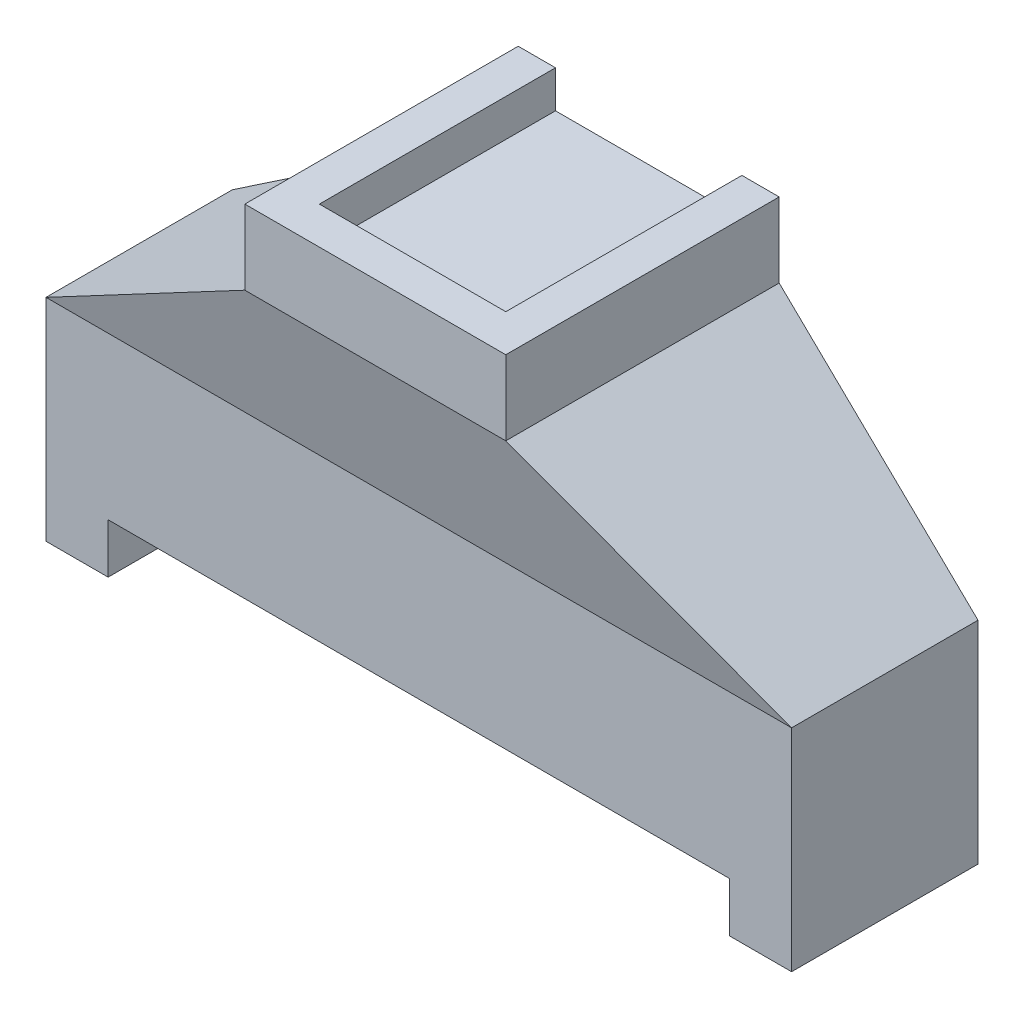
ISO-10303-21;
HEADER;
FILE_DESCRIPTION(('STEP AP214'),'2;1');
FILE_NAME('part.step','',(''),(''),'','','');
FILE_SCHEMA(('AUTOMOTIVE_DESIGN { 1 0 10303 214 1 1 1 1 }'));
ENDSEC;
DATA;
#1=APPLICATION_CONTEXT('core data for automotive mechanical design processes');
#2=APPLICATION_PROTOCOL_DEFINITION('international standard','automotive_design',2000,#1);
#3=PRODUCT_CONTEXT('',#1,'mechanical');
#4=PRODUCT('Part','Part','',(#3));
#5=PRODUCT_RELATED_PRODUCT_CATEGORY('part','',(#4));
#6=PRODUCT_DEFINITION_FORMATION('','',#4);
#7=PRODUCT_DEFINITION_CONTEXT('part definition',#1,'design');
#8=PRODUCT_DEFINITION('design','',#6,#7);
#9=PRODUCT_DEFINITION_SHAPE('','',#8);
#10=(LENGTH_UNIT() NAMED_UNIT(*) SI_UNIT(.MILLI.,.METRE.));
#11=(NAMED_UNIT(*) PLANE_ANGLE_UNIT() SI_UNIT($,.RADIAN.));
#12=(NAMED_UNIT(*) SI_UNIT($,.STERADIAN.) SOLID_ANGLE_UNIT());
#13=UNCERTAINTY_MEASURE_WITH_UNIT(LENGTH_MEASURE(1.E-05),#10,'distance_accuracy_value','');
#14=(GEOMETRIC_REPRESENTATION_CONTEXT(3) GLOBAL_UNCERTAINTY_ASSIGNED_CONTEXT((#13)) GLOBAL_UNIT_ASSIGNED_CONTEXT((#10,
#11,#12)) REPRESENTATION_CONTEXT('',''));
#15=CARTESIAN_POINT('',(0.,0.,0.));
#16=DIRECTION('',(0.,0.,1.));
#17=DIRECTION('',(1.,0.,0.));
#18=AXIS2_PLACEMENT_3D('',#15,#16,#17);
#19=CARTESIAN_POINT('',(30.,13.,7.5));
#20=DIRECTION('',(-1.,0.,0.));
#21=DIRECTION('',(0.,0.,1.));
#22=AXIS2_PLACEMENT_3D('',#19,#20,#21);
#23=PLANE('',#22);
#24=DIRECTION('',(0.,-1.,0.));
#25=VECTOR('',#24,1.);
#26=CARTESIAN_POINT('',(30.,13.,7.5));
#27=LINE('',#26,#25);
#28=CARTESIAN_POINT('',(30.,13.,7.5));
#29=VERTEX_POINT('',#28);
#30=CARTESIAN_POINT('',(30.,-4.,7.5));
#31=VERTEX_POINT('',#30);
#32=EDGE_CURVE('E292',#29,#31,#27,.T.);
#33=ORIENTED_EDGE('',*,*,#32,.T.);
#34=DIRECTION('',(0.,0.,-1.));
#35=VECTOR('',#34,1.);
#36=CARTESIAN_POINT('',(30.,-4.,7.5));
#37=LINE('',#36,#35);
#38=CARTESIAN_POINT('',(30.,-4.,-7.5));
#39=VERTEX_POINT('',#38);
#40=EDGE_CURVE('E252',#31,#39,#37,.T.);
#41=ORIENTED_EDGE('',*,*,#40,.T.);
#42=DIRECTION('',(0.,-1.,0.));
#43=VECTOR('',#42,1.);
#44=CARTESIAN_POINT('',(30.,13.,-7.5));
#45=LINE('',#44,#43);
#46=CARTESIAN_POINT('',(30.,13.,-7.5));
#47=VERTEX_POINT('',#46);
#48=EDGE_CURVE('E12',#47,#39,#45,.T.);
#49=ORIENTED_EDGE('',*,*,#48,.F.);
#50=DIRECTION('',(0.,0.,1.));
#51=VECTOR('',#50,1.);
#52=CARTESIAN_POINT('',(30.,13.,0.));
#53=LINE('',#52,#51);
#54=EDGE_CURVE('E123',#29,#47,#53,.F.);
#55=ORIENTED_EDGE('',*,*,#54,.F.);
#56=EDGE_LOOP('',(#33,#41,#49,#55));
#57=FACE_BOUND('',#56,.T.);
#58=ADVANCED_FACE('F41',(#57),#23,.F.);
#59=CARTESIAN_POINT('',(-30.,13.,-7.5));
#60=DIRECTION('',(0.,0.,1.));
#61=DIRECTION('',(1.,0.,0.));
#62=AXIS2_PLACEMENT_3D('',#59,#60,#61);
#63=PLANE('',#62);
#64=ORIENTED_EDGE('',*,*,#48,.T.);
#65=DIRECTION('',(-1.,0.,0.));
#66=VECTOR('',#65,1.);
#67=CARTESIAN_POINT('',(30.,-4.,-7.5));
#68=LINE('',#67,#66);
#69=CARTESIAN_POINT('',(25.,-4.,-7.5));
#70=VERTEX_POINT('',#69);
#71=EDGE_CURVE('E261',#39,#70,#68,.T.);
#72=ORIENTED_EDGE('',*,*,#71,.T.);
#73=DIRECTION('',(0.,1.,0.));
#74=VECTOR('',#73,1.);
#75=CARTESIAN_POINT('',(25.,-4.,-7.5));
#76=LINE('',#75,#74);
#77=CARTESIAN_POINT('',(25.,0.,-7.5));
#78=VERTEX_POINT('',#77);
#79=EDGE_CURVE('E264',#70,#78,#76,.T.);
#80=ORIENTED_EDGE('',*,*,#79,.T.);
#81=DIRECTION('',(-1.,0.,0.));
#82=VECTOR('',#81,1.);
#83=CARTESIAN_POINT('',(-30.,0.,-7.5));
#84=LINE('',#83,#82);
#85=CARTESIAN_POINT('',(-25.,0.,-7.5));
#86=VERTEX_POINT('',#85);
#87=EDGE_CURVE('E287',#78,#86,#84,.T.);
#88=ORIENTED_EDGE('',*,*,#87,.T.);
#89=DIRECTION('',(0.,1.,0.));
#90=VECTOR('',#89,1.);
#91=CARTESIAN_POINT('',(-25.,-4.,-7.5));
#92=LINE('',#91,#90);
#93=CARTESIAN_POINT('',(-25.,-4.,-7.5));
#94=VERTEX_POINT('',#93);
#95=EDGE_CURVE('E284',#94,#86,#92,.T.);
#96=ORIENTED_EDGE('',*,*,#95,.F.);
#97=DIRECTION('',(1.,0.,0.));
#98=VECTOR('',#97,1.);
#99=CARTESIAN_POINT('',(-30.,-4.,-7.5));
#100=LINE('',#99,#98);
#101=CARTESIAN_POINT('',(-30.,-4.,-7.5));
#102=VERTEX_POINT('',#101);
#103=EDGE_CURVE('E97',#102,#94,#100,.T.);
#104=ORIENTED_EDGE('',*,*,#103,.F.);
#105=DIRECTION('',(0.,-1.,0.));
#106=VECTOR('',#105,1.);
#107=CARTESIAN_POINT('',(-30.,13.,-7.5));
#108=LINE('',#107,#106);
#109=CARTESIAN_POINT('',(-30.,13.,-7.5));
#110=VERTEX_POINT('',#109);
#111=EDGE_CURVE('E50',#110,#102,#108,.T.);
#112=ORIENTED_EDGE('',*,*,#111,.F.);
#113=DIRECTION('',(1.,0.,0.));
#114=VECTOR('',#113,1.);
#115=CARTESIAN_POINT('',(0.,13.,-7.5));
#116=LINE('',#115,#114);
#117=EDGE_CURVE('E92',#47,#110,#116,.F.);
#118=ORIENTED_EDGE('',*,*,#117,.F.);
#119=EDGE_LOOP('',(#64,#72,#80,#88,#96,#104,#112,#118));
#120=FACE_BOUND('',#119,.T.);
#121=ADVANCED_FACE('F90',(#120),#63,.F.);
#122=CARTESIAN_POINT('',(-30.,13.,7.5));
#123=DIRECTION('',(1.,0.,0.));
#124=DIRECTION('',(0.,0.,-1.));
#125=AXIS2_PLACEMENT_3D('',#122,#123,#124);
#126=PLANE('',#125);
#127=ORIENTED_EDGE('',*,*,#111,.T.);
#128=DIRECTION('',(0.,0.,-1.));
#129=VECTOR('',#128,1.);
#130=CARTESIAN_POINT('',(-30.,-4.,7.5));
#131=LINE('',#130,#129);
#132=CARTESIAN_POINT('',(-30.,-4.,7.5));
#133=VERTEX_POINT('',#132);
#134=EDGE_CURVE('E270',#133,#102,#131,.T.);
#135=ORIENTED_EDGE('',*,*,#134,.F.);
#136=DIRECTION('',(0.,-1.,0.));
#137=VECTOR('',#136,1.);
#138=CARTESIAN_POINT('',(-30.,13.,7.5));
#139=LINE('',#138,#137);
#140=CARTESIAN_POINT('',(-30.,13.,7.5));
#141=VERTEX_POINT('',#140);
#142=EDGE_CURVE('E101',#141,#133,#139,.T.);
#143=ORIENTED_EDGE('',*,*,#142,.F.);
#144=DIRECTION('',(0.,0.,1.));
#145=VECTOR('',#144,1.);
#146=CARTESIAN_POINT('',(-30.,13.,0.));
#147=LINE('',#146,#145);
#148=EDGE_CURVE('E104',#110,#141,#147,.T.);
#149=ORIENTED_EDGE('',*,*,#148,.F.);
#150=EDGE_LOOP('',(#127,#135,#143,#149));
#151=FACE_BOUND('',#150,.T.);
#152=ADVANCED_FACE('F105',(#151),#126,.F.);
#153=CARTESIAN_POINT('',(-30.,13.,7.5));
#154=DIRECTION('',(0.,0.,-1.));
#155=DIRECTION('',(-1.,0.,0.));
#156=AXIS2_PLACEMENT_3D('',#153,#154,#155);
#157=PLANE('',#156);
#158=ORIENTED_EDGE('',*,*,#142,.T.);
#159=DIRECTION('',(-1.,0.,0.));
#160=VECTOR('',#159,1.);
#161=CARTESIAN_POINT('',(-30.,-4.,7.5));
#162=LINE('',#161,#160);
#163=CARTESIAN_POINT('',(-25.,-4.,7.5));
#164=VERTEX_POINT('',#163);
#165=EDGE_CURVE('E276',#164,#133,#162,.T.);
#166=ORIENTED_EDGE('',*,*,#165,.F.);
#167=DIRECTION('',(0.,1.,0.));
#168=VECTOR('',#167,1.);
#169=CARTESIAN_POINT('',(-25.,-4.,7.5));
#170=LINE('',#169,#168);
#171=CARTESIAN_POINT('',(-25.,0.,7.5));
#172=VERTEX_POINT('',#171);
#173=EDGE_CURVE('E279',#164,#172,#170,.T.);
#174=ORIENTED_EDGE('',*,*,#173,.T.);
#175=DIRECTION('',(1.,0.,0.));
#176=VECTOR('',#175,1.);
#177=CARTESIAN_POINT('',(-30.,0.,7.5));
#178=LINE('',#177,#176);
#179=CARTESIAN_POINT('',(25.,0.,7.5));
#180=VERTEX_POINT('',#179);
#181=EDGE_CURVE('E289',#172,#180,#178,.T.);
#182=ORIENTED_EDGE('',*,*,#181,.T.);
#183=DIRECTION('',(0.,1.,0.));
#184=VECTOR('',#183,1.);
#185=CARTESIAN_POINT('',(25.,-4.,7.5));
#186=LINE('',#185,#184);
#187=CARTESIAN_POINT('',(25.,-4.,7.5));
#188=VERTEX_POINT('',#187);
#189=EDGE_CURVE('E267',#188,#180,#186,.T.);
#190=ORIENTED_EDGE('',*,*,#189,.F.);
#191=DIRECTION('',(1.,0.,0.));
#192=VECTOR('',#191,1.);
#193=CARTESIAN_POINT('',(30.,-4.,7.5));
#194=LINE('',#193,#192);
#195=EDGE_CURVE('E255',#188,#31,#194,.T.);
#196=ORIENTED_EDGE('',*,*,#195,.T.);
#197=ORIENTED_EDGE('',*,*,#32,.F.);
#198=DIRECTION('',(1.,0.,0.));
#199=VECTOR('',#198,1.);
#200=CARTESIAN_POINT('',(0.,13.,7.5));
#201=LINE('',#200,#199);
#202=EDGE_CURVE('E112',#141,#29,#201,.T.);
#203=ORIENTED_EDGE('',*,*,#202,.F.);
#204=EDGE_LOOP('',(#158,#166,#174,#182,#190,#196,#197,#203));
#205=FACE_BOUND('',#204,.T.);
#206=ADVANCED_FACE('F442',(#205),#157,.F.);
#207=CARTESIAN_POINT('',(0.,0.,0.));
#208=DIRECTION('',(0.,-1.,0.));
#209=DIRECTION('',(0.,0.,-1.));
#210=AXIS2_PLACEMENT_3D('',#207,#208,#209);
#211=PLANE('',#210);
#212=DIRECTION('',(0.,0.,1.));
#213=VECTOR('',#212,1.);
#214=CARTESIAN_POINT('',(25.,0.,7.5));
#215=LINE('',#214,#213);
#216=EDGE_CURVE('E67',#78,#180,#215,.T.);
#217=ORIENTED_EDGE('',*,*,#216,.T.);
#218=ORIENTED_EDGE('',*,*,#181,.F.);
#219=DIRECTION('',(0.,0.,1.));
#220=VECTOR('',#219,1.);
#221=CARTESIAN_POINT('',(-25.,0.,7.5));
#222=LINE('',#221,#220);
#223=EDGE_CURVE('E269',#86,#172,#222,.T.);
#224=ORIENTED_EDGE('',*,*,#223,.F.);
#225=ORIENTED_EDGE('',*,*,#87,.F.);
#226=EDGE_LOOP('',(#217,#218,#224,#225));
#227=FACE_BOUND('',#226,.T.);
#228=ADVANCED_FACE('F434',(#227),#211,.T.);
#229=CARTESIAN_POINT('',(-25.,-4.,7.5));
#230=DIRECTION('',(-1.,0.,0.));
#231=DIRECTION('',(0.,0.,1.));
#232=AXIS2_PLACEMENT_3D('',#229,#230,#231);
#233=PLANE('',#232);
#234=ORIENTED_EDGE('',*,*,#223,.T.);
#235=ORIENTED_EDGE('',*,*,#173,.F.);
#236=DIRECTION('',(0.,0.,1.));
#237=VECTOR('',#236,1.);
#238=CARTESIAN_POINT('',(-25.,-4.,7.5));
#239=LINE('',#238,#237);
#240=EDGE_CURVE('E273',#94,#164,#239,.T.);
#241=ORIENTED_EDGE('',*,*,#240,.F.);
#242=ORIENTED_EDGE('',*,*,#95,.T.);
#243=EDGE_LOOP('',(#234,#235,#241,#242));
#244=FACE_BOUND('',#243,.T.);
#245=ADVANCED_FACE('F439',(#244),#233,.F.);
#246=CARTESIAN_POINT('',(0.,-4.,0.));
#247=DIRECTION('',(0.,-1.,0.));
#248=DIRECTION('',(0.,0.,-1.));
#249=AXIS2_PLACEMENT_3D('',#246,#247,#248);
#250=PLANE('',#249);
#251=ORIENTED_EDGE('',*,*,#134,.T.);
#252=ORIENTED_EDGE('',*,*,#103,.T.);
#253=ORIENTED_EDGE('',*,*,#240,.T.);
#254=ORIENTED_EDGE('',*,*,#165,.T.);
#255=EDGE_LOOP('',(#251,#252,#253,#254));
#256=FACE_BOUND('',#255,.T.);
#257=ADVANCED_FACE('F444',(#256),#250,.T.);
#258=CARTESIAN_POINT('',(25.,-4.,7.5));
#259=DIRECTION('',(-1.,0.,0.));
#260=DIRECTION('',(0.,0.,1.));
#261=AXIS2_PLACEMENT_3D('',#258,#259,#260);
#262=PLANE('',#261);
#263=ORIENTED_EDGE('',*,*,#216,.F.);
#264=ORIENTED_EDGE('',*,*,#79,.F.);
#265=DIRECTION('',(0.,0.,1.));
#266=VECTOR('',#265,1.);
#267=CARTESIAN_POINT('',(25.,-4.,7.5));
#268=LINE('',#267,#266);
#269=EDGE_CURVE('E258',#70,#188,#268,.T.);
#270=ORIENTED_EDGE('',*,*,#269,.T.);
#271=ORIENTED_EDGE('',*,*,#189,.T.);
#272=EDGE_LOOP('',(#263,#264,#270,#271));
#273=FACE_BOUND('',#272,.T.);
#274=ADVANCED_FACE('F447',(#273),#262,.T.);
#275=CARTESIAN_POINT('',(0.,-4.,0.));
#276=DIRECTION('',(0.,-1.,0.));
#277=DIRECTION('',(0.,0.,-1.));
#278=AXIS2_PLACEMENT_3D('',#275,#276,#277);
#279=PLANE('',#278);
#280=ORIENTED_EDGE('',*,*,#40,.F.);
#281=ORIENTED_EDGE('',*,*,#195,.F.);
#282=ORIENTED_EDGE('',*,*,#269,.F.);
#283=ORIENTED_EDGE('',*,*,#71,.F.);
#284=EDGE_LOOP('',(#280,#281,#282,#283));
#285=FACE_BOUND('',#284,.T.);
#286=ADVANCED_FACE('F451',(#285),#279,.T.);
#287=CARTESIAN_POINT('',(-14.0429184549356,22.8197424892704,0.));
#288=DIRECTION('',(-0.524097425664335,0.851658316704544,0.));
#289=DIRECTION('',(-0.851658316704544,-0.524097425664335,0.));
#290=AXIS2_PLACEMENT_3D('',#287,#288,#289);
#291=PLANE('',#290);
#292=DIRECTION('',(0.841879138963874,0.518079470131615,0.151106512121721));
#293=VECTOR('',#292,1.);
#294=CARTESIAN_POINT('',(-30.,13.,7.5));
#295=LINE('',#294,#293);
#296=CARTESIAN_POINT('',(-10.5,25.,11.));
#297=VERTEX_POINT('',#296);
#298=EDGE_CURVE('E130',#141,#297,#295,.T.);
#299=ORIENTED_EDGE('',*,*,#298,.T.);
#300=DIRECTION('',(0.,0.,-1.));
#301=VECTOR('',#300,1.);
#302=CARTESIAN_POINT('',(-10.5,25.,11.));
#303=LINE('',#302,#301);
#304=CARTESIAN_POINT('',(-10.5,25.,-11.));
#305=VERTEX_POINT('',#304);
#306=EDGE_CURVE('E44',#297,#305,#303,.T.);
#307=ORIENTED_EDGE('',*,*,#306,.T.);
#308=DIRECTION('',(0.841879138963874,0.518079470131615,-0.151106512121721));
#309=VECTOR('',#308,1.);
#310=CARTESIAN_POINT('',(-30.,13.,-7.5));
#311=LINE('',#310,#309);
#312=EDGE_CURVE('E120',#110,#305,#311,.T.);
#313=ORIENTED_EDGE('',*,*,#312,.F.);
#314=ORIENTED_EDGE('',*,*,#148,.T.);
#315=EDGE_LOOP('',(#299,#307,#313,#314));
#316=FACE_BOUND('',#315,.T.);
#317=ADVANCED_FACE('F126',(#316),#291,.T.);
#318=CARTESIAN_POINT('',(0.,-0.9968,-3.4176));
#319=DIRECTION('',(0.,0.28,0.96));
#320=DIRECTION('',(0.,-0.96,0.28));
#321=AXIS2_PLACEMENT_3D('',#318,#319,#320);
#322=PLANE('',#321);
#323=ORIENTED_EDGE('',*,*,#312,.T.);
#324=DIRECTION('',(1.,0.,0.));
#325=VECTOR('',#324,1.);
#326=CARTESIAN_POINT('',(-10.5,25.,-11.));
#327=LINE('',#326,#325);
#328=CARTESIAN_POINT('',(10.5,25.,-11.));
#329=VERTEX_POINT('',#328);
#330=EDGE_CURVE('E144',#305,#329,#327,.T.);
#331=ORIENTED_EDGE('',*,*,#330,.T.);
#332=DIRECTION('',(-0.841879138963874,0.518079470131615,-0.151106512121721));
#333=VECTOR('',#332,1.);
#334=CARTESIAN_POINT('',(30.,13.,-7.5));
#335=LINE('',#334,#333);
#336=EDGE_CURVE('E122',#47,#329,#335,.T.);
#337=ORIENTED_EDGE('',*,*,#336,.F.);
#338=ORIENTED_EDGE('',*,*,#117,.T.);
#339=EDGE_LOOP('',(#323,#331,#337,#338));
#340=FACE_BOUND('',#339,.T.);
#341=ADVANCED_FACE('F117',(#340),#322,.F.);
#342=CARTESIAN_POINT('',(0.,-0.996799999999999,3.41759999999999));
#343=DIRECTION('',(0.,0.28,-0.96));
#344=DIRECTION('',(0.,0.96,0.28));
#345=AXIS2_PLACEMENT_3D('',#342,#343,#344);
#346=PLANE('',#345);
#347=DIRECTION('',(-0.841879138963874,0.518079470131615,0.151106512121721));
#348=VECTOR('',#347,1.);
#349=CARTESIAN_POINT('',(30.,13.,7.5));
#350=LINE('',#349,#348);
#351=CARTESIAN_POINT('',(10.5,25.,11.));
#352=VERTEX_POINT('',#351);
#353=EDGE_CURVE('E129',#29,#352,#350,.T.);
#354=ORIENTED_EDGE('',*,*,#353,.T.);
#355=DIRECTION('',(-1.,0.,0.));
#356=VECTOR('',#355,1.);
#357=CARTESIAN_POINT('',(-10.5,25.,11.));
#358=LINE('',#357,#356);
#359=EDGE_CURVE('E245',#352,#297,#358,.T.);
#360=ORIENTED_EDGE('',*,*,#359,.T.);
#361=ORIENTED_EDGE('',*,*,#298,.F.);
#362=ORIENTED_EDGE('',*,*,#202,.T.);
#363=EDGE_LOOP('',(#354,#360,#361,#362));
#364=FACE_BOUND('',#363,.T.);
#365=ADVANCED_FACE('F158',(#364),#346,.F.);
#366=CARTESIAN_POINT('',(14.0429184549356,22.8197424892704,0.));
#367=DIRECTION('',(0.524097425664335,0.851658316704544,0.));
#368=DIRECTION('',(-0.851658316704544,0.524097425664335,0.));
#369=AXIS2_PLACEMENT_3D('',#366,#367,#368);
#370=PLANE('',#369);
#371=ORIENTED_EDGE('',*,*,#336,.T.);
#372=DIRECTION('',(0.,0.,1.));
#373=VECTOR('',#372,1.);
#374=CARTESIAN_POINT('',(10.5,25.,11.));
#375=LINE('',#374,#373);
#376=EDGE_CURVE('E185',#329,#352,#375,.T.);
#377=ORIENTED_EDGE('',*,*,#376,.T.);
#378=ORIENTED_EDGE('',*,*,#353,.F.);
#379=ORIENTED_EDGE('',*,*,#54,.T.);
#380=EDGE_LOOP('',(#371,#377,#378,#379));
#381=FACE_BOUND('',#380,.T.);
#382=ADVANCED_FACE('F164',(#381),#370,.T.);
#383=CARTESIAN_POINT('',(10.5,25.,11.));
#384=DIRECTION('',(-1.,0.,0.));
#385=DIRECTION('',(0.,0.,1.));
#386=AXIS2_PLACEMENT_3D('',#383,#384,#385);
#387=PLANE('',#386);
#388=DIRECTION('',(0.,1.,0.));
#389=VECTOR('',#388,1.);
#390=CARTESIAN_POINT('',(10.5,25.,-11.));
#391=LINE('',#390,#389);
#392=CARTESIAN_POINT('',(10.5,31.,-11.));
#393=VERTEX_POINT('',#392);
#394=EDGE_CURVE('E306',#329,#393,#391,.T.);
#395=ORIENTED_EDGE('',*,*,#394,.T.);
#396=DIRECTION('',(0.,0.,1.));
#397=VECTOR('',#396,1.);
#398=CARTESIAN_POINT('',(10.5,31.,-11.));
#399=LINE('',#398,#397);
#400=CARTESIAN_POINT('',(10.5,31.,11.));
#401=VERTEX_POINT('',#400);
#402=EDGE_CURVE('E363',#393,#401,#399,.T.);
#403=ORIENTED_EDGE('',*,*,#402,.T.);
#404=DIRECTION('',(0.,1.,0.));
#405=VECTOR('',#404,1.);
#406=CARTESIAN_POINT('',(10.5,25.,11.));
#407=LINE('',#406,#405);
#408=EDGE_CURVE('E134',#352,#401,#407,.T.);
#409=ORIENTED_EDGE('',*,*,#408,.F.);
#410=ORIENTED_EDGE('',*,*,#376,.F.);
#411=EDGE_LOOP('',(#395,#403,#409,#410));
#412=FACE_BOUND('',#411,.T.);
#413=ADVANCED_FACE('F225',(#412),#387,.F.);
#414=CARTESIAN_POINT('',(-10.5,25.,11.));
#415=DIRECTION('',(0.,0.,-1.));
#416=DIRECTION('',(-1.,0.,0.));
#417=AXIS2_PLACEMENT_3D('',#414,#415,#416);
#418=PLANE('',#417);
#419=ORIENTED_EDGE('',*,*,#408,.T.);
#420=DIRECTION('',(-1.,0.,0.));
#421=VECTOR('',#420,1.);
#422=CARTESIAN_POINT('',(10.5,31.,11.));
#423=LINE('',#422,#421);
#424=CARTESIAN_POINT('',(-10.5,31.,11.));
#425=VERTEX_POINT('',#424);
#426=EDGE_CURVE('E345',#401,#425,#423,.T.);
#427=ORIENTED_EDGE('',*,*,#426,.T.);
#428=DIRECTION('',(0.,1.,0.));
#429=VECTOR('',#428,1.);
#430=CARTESIAN_POINT('',(-10.5,25.,11.));
#431=LINE('',#430,#429);
#432=EDGE_CURVE('E242',#297,#425,#431,.T.);
#433=ORIENTED_EDGE('',*,*,#432,.F.);
#434=ORIENTED_EDGE('',*,*,#359,.F.);
#435=EDGE_LOOP('',(#419,#427,#433,#434));
#436=FACE_BOUND('',#435,.T.);
#437=ADVANCED_FACE('F220',(#436),#418,.F.);
#438=CARTESIAN_POINT('',(-10.5,25.,11.));
#439=DIRECTION('',(1.,0.,0.));
#440=DIRECTION('',(0.,0.,-1.));
#441=AXIS2_PLACEMENT_3D('',#438,#439,#440);
#442=PLANE('',#441);
#443=ORIENTED_EDGE('',*,*,#432,.T.);
#444=DIRECTION('',(0.,0.,-1.));
#445=VECTOR('',#444,1.);
#446=CARTESIAN_POINT('',(-10.5,31.,11.));
#447=LINE('',#446,#445);
#448=CARTESIAN_POINT('',(-10.5,31.,-11.));
#449=VERTEX_POINT('',#448);
#450=EDGE_CURVE('E354',#425,#449,#447,.T.);
#451=ORIENTED_EDGE('',*,*,#450,.T.);
#452=DIRECTION('',(0.,1.,0.));
#453=VECTOR('',#452,1.);
#454=CARTESIAN_POINT('',(-10.5,25.,-11.));
#455=LINE('',#454,#453);
#456=EDGE_CURVE('E300',#305,#449,#455,.T.);
#457=ORIENTED_EDGE('',*,*,#456,.F.);
#458=ORIENTED_EDGE('',*,*,#306,.F.);
#459=EDGE_LOOP('',(#443,#451,#457,#458));
#460=FACE_BOUND('',#459,.T.);
#461=ADVANCED_FACE('F209',(#460),#442,.F.);
#462=CARTESIAN_POINT('',(-10.5,25.,-11.));
#463=DIRECTION('',(0.,0.,1.));
#464=DIRECTION('',(1.,0.,0.));
#465=AXIS2_PLACEMENT_3D('',#462,#463,#464);
#466=PLANE('',#465);
#467=ORIENTED_EDGE('',*,*,#456,.T.);
#468=DIRECTION('',(1.,0.,0.));
#469=VECTOR('',#468,1.);
#470=CARTESIAN_POINT('',(-10.5,31.,-11.));
#471=LINE('',#470,#469);
#472=CARTESIAN_POINT('',(-7.5,31.,-11.));
#473=VERTEX_POINT('',#472);
#474=EDGE_CURVE('E377',#449,#473,#471,.T.);
#475=ORIENTED_EDGE('',*,*,#474,.T.);
#476=DIRECTION('',(0.,-1.,0.));
#477=VECTOR('',#476,1.);
#478=CARTESIAN_POINT('',(-7.5,31.,-11.));
#479=LINE('',#478,#477);
#480=CARTESIAN_POINT('',(-7.5,28.,-11.));
#481=VERTEX_POINT('',#480);
#482=EDGE_CURVE('E341',#473,#481,#479,.T.);
#483=ORIENTED_EDGE('',*,*,#482,.T.);
#484=DIRECTION('',(1.,0.,0.));
#485=VECTOR('',#484,1.);
#486=CARTESIAN_POINT('',(-10.5,28.,-11.));
#487=LINE('',#486,#485);
#488=CARTESIAN_POINT('',(7.49999999999999,28.,-11.));
#489=VERTEX_POINT('',#488);
#490=EDGE_CURVE('E312',#481,#489,#487,.T.);
#491=ORIENTED_EDGE('',*,*,#490,.T.);
#492=DIRECTION('',(0.,-1.,0.));
#493=VECTOR('',#492,1.);
#494=CARTESIAN_POINT('',(7.5,31.,-11.));
#495=LINE('',#494,#493);
#496=CARTESIAN_POINT('',(7.5,31.,-11.));
#497=VERTEX_POINT('',#496);
#498=EDGE_CURVE('E58',#497,#489,#495,.T.);
#499=ORIENTED_EDGE('',*,*,#498,.F.);
#500=DIRECTION('',(1.,0.,0.));
#501=VECTOR('',#500,1.);
#502=CARTESIAN_POINT('',(7.5,31.,-11.));
#503=LINE('',#502,#501);
#504=EDGE_CURVE('E366',#497,#393,#503,.T.);
#505=ORIENTED_EDGE('',*,*,#504,.T.);
#506=ORIENTED_EDGE('',*,*,#394,.F.);
#507=ORIENTED_EDGE('',*,*,#330,.F.);
#508=EDGE_LOOP('',(#467,#475,#483,#491,#499,#505,#506,#507));
#509=FACE_BOUND('',#508,.T.);
#510=ADVANCED_FACE('F219',(#509),#466,.F.);
#511=CARTESIAN_POINT('',(0.,28.,0.));
#512=DIRECTION('',(0.,-1.,0.));
#513=DIRECTION('',(0.,0.,-1.));
#514=AXIS2_PLACEMENT_3D('',#511,#512,#513);
#515=PLANE('',#514);
#516=ORIENTED_EDGE('',*,*,#490,.F.);
#517=DIRECTION('',(0.,0.,1.));
#518=VECTOR('',#517,1.);
#519=CARTESIAN_POINT('',(-7.5,28.,-11.));
#520=LINE('',#519,#518);
#521=CARTESIAN_POINT('',(-7.5,28.,8.));
#522=VERTEX_POINT('',#521);
#523=EDGE_CURVE('E358',#481,#522,#520,.T.);
#524=ORIENTED_EDGE('',*,*,#523,.T.);
#525=DIRECTION('',(1.,0.,0.));
#526=VECTOR('',#525,1.);
#527=CARTESIAN_POINT('',(-7.5,28.,8.));
#528=LINE('',#527,#526);
#529=CARTESIAN_POINT('',(7.5,28.,8.00000000000001));
#530=VERTEX_POINT('',#529);
#531=EDGE_CURVE('E355',#522,#530,#528,.T.);
#532=ORIENTED_EDGE('',*,*,#531,.T.);
#533=DIRECTION('',(0.,0.,-1.));
#534=VECTOR('',#533,1.);
#535=CARTESIAN_POINT('',(7.5,28.,8.00000000000001));
#536=LINE('',#535,#534);
#537=EDGE_CURVE('E352',#530,#489,#536,.T.);
#538=ORIENTED_EDGE('',*,*,#537,.T.);
#539=EDGE_LOOP('',(#516,#524,#532,#538));
#540=FACE_BOUND('',#539,.T.);
#541=ADVANCED_FACE('F511',(#540),#515,.F.);
#542=CARTESIAN_POINT('',(7.5,31.,8.00000000000001));
#543=DIRECTION('',(-1.,0.,0.));
#544=DIRECTION('',(0.,0.,1.));
#545=AXIS2_PLACEMENT_3D('',#542,#543,#544);
#546=PLANE('',#545);
#547=ORIENTED_EDGE('',*,*,#537,.F.);
#548=DIRECTION('',(0.,-1.,0.));
#549=VECTOR('',#548,1.);
#550=CARTESIAN_POINT('',(7.5,31.,8.00000000000001));
#551=LINE('',#550,#549);
#552=CARTESIAN_POINT('',(7.5,31.,8.00000000000001));
#553=VERTEX_POINT('',#552);
#554=EDGE_CURVE('E348',#553,#530,#551,.T.);
#555=ORIENTED_EDGE('',*,*,#554,.F.);
#556=DIRECTION('',(0.,0.,-1.));
#557=VECTOR('',#556,1.);
#558=CARTESIAN_POINT('',(7.5,31.,8.00000000000001));
#559=LINE('',#558,#557);
#560=EDGE_CURVE('E369',#553,#497,#559,.T.);
#561=ORIENTED_EDGE('',*,*,#560,.T.);
#562=ORIENTED_EDGE('',*,*,#498,.T.);
#563=EDGE_LOOP('',(#547,#555,#561,#562));
#564=FACE_BOUND('',#563,.T.);
#565=ADVANCED_FACE('F517',(#564),#546,.T.);
#566=CARTESIAN_POINT('',(-7.5,31.,8.));
#567=DIRECTION('',(0.,0.,-1.));
#568=DIRECTION('',(-1.,0.,0.));
#569=AXIS2_PLACEMENT_3D('',#566,#567,#568);
#570=PLANE('',#569);
#571=ORIENTED_EDGE('',*,*,#531,.F.);
#572=DIRECTION('',(0.,-1.,0.));
#573=VECTOR('',#572,1.);
#574=CARTESIAN_POINT('',(-7.5,31.,8.));
#575=LINE('',#574,#573);
#576=CARTESIAN_POINT('',(-7.5,31.,8.));
#577=VERTEX_POINT('',#576);
#578=EDGE_CURVE('E344',#577,#522,#575,.T.);
#579=ORIENTED_EDGE('',*,*,#578,.F.);
#580=DIRECTION('',(1.,0.,0.));
#581=VECTOR('',#580,1.);
#582=CARTESIAN_POINT('',(-7.5,31.,8.));
#583=LINE('',#582,#581);
#584=EDGE_CURVE('E371',#577,#553,#583,.T.);
#585=ORIENTED_EDGE('',*,*,#584,.T.);
#586=ORIENTED_EDGE('',*,*,#554,.T.);
#587=EDGE_LOOP('',(#571,#579,#585,#586));
#588=FACE_BOUND('',#587,.T.);
#589=ADVANCED_FACE('F524',(#588),#570,.T.);
#590=CARTESIAN_POINT('',(-7.5,31.,-11.));
#591=DIRECTION('',(1.,0.,0.));
#592=DIRECTION('',(0.,0.,-1.));
#593=AXIS2_PLACEMENT_3D('',#590,#591,#592);
#594=PLANE('',#593);
#595=ORIENTED_EDGE('',*,*,#523,.F.);
#596=ORIENTED_EDGE('',*,*,#482,.F.);
#597=DIRECTION('',(0.,0.,1.));
#598=VECTOR('',#597,1.);
#599=CARTESIAN_POINT('',(-7.5,31.,-11.));
#600=LINE('',#599,#598);
#601=EDGE_CURVE('E374',#473,#577,#600,.T.);
#602=ORIENTED_EDGE('',*,*,#601,.T.);
#603=ORIENTED_EDGE('',*,*,#578,.T.);
#604=EDGE_LOOP('',(#595,#596,#602,#603));
#605=FACE_BOUND('',#604,.T.);
#606=ADVANCED_FACE('F531',(#605),#594,.T.);
#607=CARTESIAN_POINT('',(0.,31.,0.));
#608=DIRECTION('',(0.,-1.,0.));
#609=DIRECTION('',(0.,0.,-1.));
#610=AXIS2_PLACEMENT_3D('',#607,#608,#609);
#611=PLANE('',#610);
#612=ORIENTED_EDGE('',*,*,#450,.F.);
#613=ORIENTED_EDGE('',*,*,#426,.F.);
#614=ORIENTED_EDGE('',*,*,#402,.F.);
#615=ORIENTED_EDGE('',*,*,#504,.F.);
#616=ORIENTED_EDGE('',*,*,#560,.F.);
#617=ORIENTED_EDGE('',*,*,#584,.F.);
#618=ORIENTED_EDGE('',*,*,#601,.F.);
#619=ORIENTED_EDGE('',*,*,#474,.F.);
#620=EDGE_LOOP('',(#612,#613,#614,#615,#616,#617,#618,#619));
#621=FACE_BOUND('',#620,.T.);
#622=ADVANCED_FACE('F384',(#621),#611,.F.);
#623=CLOSED_SHELL('',(#58,#121,#152,#206,#228,#245,#257,#274,#286,#317,#341,#365,#382,#413,#437,
#461,#510,#541,#565,#589,#606,#622));
#624=MANIFOLD_SOLID_BREP('B2',#623);
#625=ADVANCED_BREP_SHAPE_REPRESENTATION('',(#18,#624),#14);
#626=SHAPE_DEFINITION_REPRESENTATION(#9,#625);
ENDSEC;
END-ISO-10303-21;
